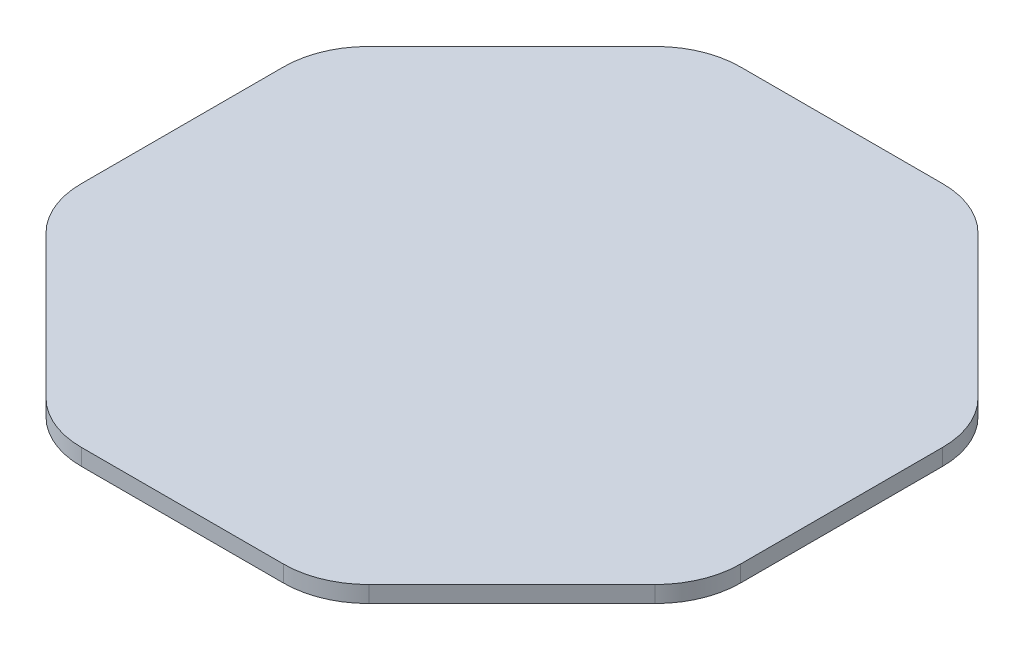
ISO-10303-21;
HEADER;
FILE_DESCRIPTION(('STEP AP214'),'2;1');
FILE_NAME('part.step','',(''),(''),'','','');
FILE_SCHEMA(('AUTOMOTIVE_DESIGN { 1 0 10303 214 1 1 1 1 }'));
ENDSEC;
DATA;
#1=APPLICATION_CONTEXT('core data for automotive mechanical design processes');
#2=APPLICATION_PROTOCOL_DEFINITION('international standard','automotive_design',2000,#1);
#3=PRODUCT_CONTEXT('',#1,'mechanical');
#4=PRODUCT('Part','Part','',(#3));
#5=PRODUCT_RELATED_PRODUCT_CATEGORY('part','',(#4));
#6=PRODUCT_DEFINITION_FORMATION('','',#4);
#7=PRODUCT_DEFINITION_CONTEXT('part definition',#1,'design');
#8=PRODUCT_DEFINITION('design','',#6,#7);
#9=PRODUCT_DEFINITION_SHAPE('','',#8);
#10=(LENGTH_UNIT() NAMED_UNIT(*) SI_UNIT(.MILLI.,.METRE.));
#11=(NAMED_UNIT(*) PLANE_ANGLE_UNIT() SI_UNIT($,.RADIAN.));
#12=(NAMED_UNIT(*) SI_UNIT($,.STERADIAN.) SOLID_ANGLE_UNIT());
#13=UNCERTAINTY_MEASURE_WITH_UNIT(LENGTH_MEASURE(1.E-05),#10,'distance_accuracy_value','');
#14=(GEOMETRIC_REPRESENTATION_CONTEXT(3) GLOBAL_UNCERTAINTY_ASSIGNED_CONTEXT((#13)) GLOBAL_UNIT_ASSIGNED_CONTEXT((#10,
#11,#12)) REPRESENTATION_CONTEXT('',''));
#15=CARTESIAN_POINT('',(0.,0.,0.));
#16=DIRECTION('',(0.,0.,1.));
#17=DIRECTION('',(1.,0.,0.));
#18=AXIS2_PLACEMENT_3D('',#15,#16,#17);
#19=CARTESIAN_POINT('',(0.,0.,0.));
#20=DIRECTION('',(0.,1.,0.));
#21=DIRECTION('',(0.,0.,1.));
#22=AXIS2_PLACEMENT_3D('',#19,#20,#21);
#23=PLANE('',#22);
#24=DIRECTION('',(0.,0.,-1.));
#25=VECTOR('',#24,1.);
#26=CARTESIAN_POINT('',(60.,0.,0.));
#27=LINE('',#26,#25);
#28=CARTESIAN_POINT('',(60.,0.,18.4325035256027));
#29=VERTEX_POINT('',#28);
#30=CARTESIAN_POINT('',(60.,0.,-18.4325035256027));
#31=VERTEX_POINT('',#30);
#32=EDGE_CURVE('E227',#29,#31,#27,.T.);
#33=ORIENTED_EDGE('',*,*,#32,.F.);
#34=CARTESIAN_POINT('',(44.5,0.,18.4325035256027));
#35=DIRECTION('',(0.,1.,0.));
#36=DIRECTION('',(0.,0.,1.));
#37=AXIS2_PLACEMENT_3D('',#34,#35,#36);
#38=CIRCLE('',#37,15.5);
#39=CARTESIAN_POINT('',(55.4601551083915,0.,29.3926586339941));
#40=VERTEX_POINT('',#39);
#41=EDGE_CURVE('E210',#29,#40,#38,.F.);
#42=ORIENTED_EDGE('',*,*,#41,.T.);
#43=DIRECTION('',(0.707106781186547,0.,-0.707106781186548));
#44=VECTOR('',#43,1.);
#45=CARTESIAN_POINT('',(42.4264068711929,0.,42.4264068711928));
#46=LINE('',#45,#44);
#47=CARTESIAN_POINT('',(29.3926586339942,0.,55.4601551083915));
#48=VERTEX_POINT('',#47);
#49=EDGE_CURVE('E236',#48,#40,#46,.T.);
#50=ORIENTED_EDGE('',*,*,#49,.F.);
#51=CARTESIAN_POINT('',(18.4325035256027,0.,44.5));
#52=DIRECTION('',(0.,1.,0.));
#53=DIRECTION('',(0.,0.,1.));
#54=AXIS2_PLACEMENT_3D('',#51,#52,#53);
#55=CIRCLE('',#54,15.5);
#56=CARTESIAN_POINT('',(18.4325035256027,0.,60.));
#57=VERTEX_POINT('',#56);
#58=EDGE_CURVE('E231',#48,#57,#55,.F.);
#59=ORIENTED_EDGE('',*,*,#58,.T.);
#60=DIRECTION('',(1.,0.,0.));
#61=VECTOR('',#60,1.);
#62=CARTESIAN_POINT('',(0.,0.,60.));
#63=LINE('',#62,#61);
#64=CARTESIAN_POINT('',(-18.4325035256026,0.,60.));
#65=VERTEX_POINT('',#64);
#66=EDGE_CURVE('E241',#65,#57,#63,.T.);
#67=ORIENTED_EDGE('',*,*,#66,.F.);
#68=CARTESIAN_POINT('',(-18.4325035256026,0.,44.5));
#69=DIRECTION('',(0.,1.,0.));
#70=DIRECTION('',(0.,0.,1.));
#71=AXIS2_PLACEMENT_3D('',#68,#69,#70);
#72=CIRCLE('',#71,15.5);
#73=CARTESIAN_POINT('',(-29.3926586339941,0.,55.4601551083915));
#74=VERTEX_POINT('',#73);
#75=EDGE_CURVE('E253',#65,#74,#72,.F.);
#76=ORIENTED_EDGE('',*,*,#75,.T.);
#77=DIRECTION('',(0.707106781186548,0.,0.707106781186547));
#78=VECTOR('',#77,1.);
#79=CARTESIAN_POINT('',(-42.4264068711928,0.,42.4264068711929));
#80=LINE('',#79,#78);
#81=CARTESIAN_POINT('',(-55.4601551083915,0.,29.3926586339942));
#82=VERTEX_POINT('',#81);
#83=EDGE_CURVE('E329',#82,#74,#80,.T.);
#84=ORIENTED_EDGE('',*,*,#83,.F.);
#85=CARTESIAN_POINT('',(-44.5,0.,18.4325035256027));
#86=DIRECTION('',(0.,1.,0.));
#87=DIRECTION('',(0.,0.,1.));
#88=AXIS2_PLACEMENT_3D('',#85,#86,#87);
#89=CIRCLE('',#88,15.5);
#90=CARTESIAN_POINT('',(-60.,0.,18.4325035256027));
#91=VERTEX_POINT('',#90);
#92=EDGE_CURVE('E255',#82,#91,#89,.F.);
#93=ORIENTED_EDGE('',*,*,#92,.T.);
#94=DIRECTION('',(0.,0.,1.));
#95=VECTOR('',#94,1.);
#96=CARTESIAN_POINT('',(-60.,0.,0.));
#97=LINE('',#96,#95);
#98=CARTESIAN_POINT('',(-60.,0.,-18.4325035256026));
#99=VERTEX_POINT('',#98);
#100=EDGE_CURVE('E330',#99,#91,#97,.T.);
#101=ORIENTED_EDGE('',*,*,#100,.F.);
#102=CARTESIAN_POINT('',(-44.5,0.,-18.4325035256026));
#103=DIRECTION('',(0.,1.,0.));
#104=DIRECTION('',(0.,0.,1.));
#105=AXIS2_PLACEMENT_3D('',#102,#103,#104);
#106=CIRCLE('',#105,15.5);
#107=CARTESIAN_POINT('',(-55.4601551083915,0.,-29.3926586339941));
#108=VERTEX_POINT('',#107);
#109=EDGE_CURVE('E257',#99,#108,#106,.F.);
#110=ORIENTED_EDGE('',*,*,#109,.T.);
#111=DIRECTION('',(-0.707106781186547,0.,0.707106781186548));
#112=VECTOR('',#111,1.);
#113=CARTESIAN_POINT('',(-42.4264068711929,0.,-42.4264068711928));
#114=LINE('',#113,#112);
#115=CARTESIAN_POINT('',(-29.3926586339942,0.,-55.4601551083915));
#116=VERTEX_POINT('',#115);
#117=EDGE_CURVE('E247',#116,#108,#114,.T.);
#118=ORIENTED_EDGE('',*,*,#117,.F.);
#119=CARTESIAN_POINT('',(-18.4325035256027,0.,-44.5));
#120=DIRECTION('',(0.,1.,0.));
#121=DIRECTION('',(0.,0.,1.));
#122=AXIS2_PLACEMENT_3D('',#119,#120,#121);
#123=CIRCLE('',#122,15.5);
#124=CARTESIAN_POINT('',(-18.4325035256027,0.,-60.));
#125=VERTEX_POINT('',#124);
#126=EDGE_CURVE('E259',#116,#125,#123,.F.);
#127=ORIENTED_EDGE('',*,*,#126,.T.);
#128=DIRECTION('',(-1.,0.,0.));
#129=VECTOR('',#128,1.);
#130=CARTESIAN_POINT('',(0.,0.,-60.));
#131=LINE('',#130,#129);
#132=CARTESIAN_POINT('',(18.4325035256027,0.,-60.));
#133=VERTEX_POINT('',#132);
#134=EDGE_CURVE('E239',#133,#125,#131,.T.);
#135=ORIENTED_EDGE('',*,*,#134,.F.);
#136=CARTESIAN_POINT('',(18.4325035256027,0.,-44.5));
#137=DIRECTION('',(0.,1.,0.));
#138=DIRECTION('',(0.,0.,1.));
#139=AXIS2_PLACEMENT_3D('',#136,#137,#138);
#140=CIRCLE('',#139,15.5);
#141=CARTESIAN_POINT('',(29.3926586339942,0.,-55.4601551083915));
#142=VERTEX_POINT('',#141);
#143=EDGE_CURVE('E261',#133,#142,#140,.F.);
#144=ORIENTED_EDGE('',*,*,#143,.T.);
#145=DIRECTION('',(-0.707106781186548,0.,-0.707106781186547));
#146=VECTOR('',#145,1.);
#147=CARTESIAN_POINT('',(42.4264068711928,0.,-42.4264068711929));
#148=LINE('',#147,#146);
#149=CARTESIAN_POINT('',(55.4601551083915,0.,-29.3926586339942));
#150=VERTEX_POINT('',#149);
#151=EDGE_CURVE('E235',#150,#142,#148,.T.);
#152=ORIENTED_EDGE('',*,*,#151,.F.);
#153=CARTESIAN_POINT('',(44.5,0.,-18.4325035256027));
#154=DIRECTION('',(0.,1.,0.));
#155=DIRECTION('',(0.,0.,1.));
#156=AXIS2_PLACEMENT_3D('',#153,#154,#155);
#157=CIRCLE('',#156,15.5);
#158=EDGE_CURVE('E221',#150,#31,#157,.F.);
#159=ORIENTED_EDGE('',*,*,#158,.T.);
#160=EDGE_LOOP('',(#33,#42,#50,#59,#67,#76,#84,#93,#101,#110,#118,#127,#135,#144,#152,#159));
#161=FACE_BOUND('',#160,.T.);
#162=ADVANCED_FACE('F95',(#161),#23,.F.);
#163=CARTESIAN_POINT('',(60.,3.,0.));
#164=DIRECTION('',(-1.,0.,0.));
#165=DIRECTION('',(0.,0.,1.));
#166=AXIS2_PLACEMENT_3D('',#163,#164,#165);
#167=PLANE('',#166);
#168=DIRECTION('',(0.,0.,-1.));
#169=VECTOR('',#168,1.);
#170=CARTESIAN_POINT('',(60.,3.,0.));
#171=LINE('',#170,#169);
#172=CARTESIAN_POINT('',(60.,3.,18.4325035256027));
#173=VERTEX_POINT('',#172);
#174=CARTESIAN_POINT('',(60.,3.,-18.4325035256027));
#175=VERTEX_POINT('',#174);
#176=EDGE_CURVE('E230',#173,#175,#171,.T.);
#177=ORIENTED_EDGE('',*,*,#176,.F.);
#178=DIRECTION('',(0.,-1.,0.));
#179=VECTOR('',#178,1.);
#180=CARTESIAN_POINT('',(60.,3.,18.4325035256027));
#181=LINE('',#180,#179);
#182=EDGE_CURVE('E214',#173,#29,#181,.T.);
#183=ORIENTED_EDGE('',*,*,#182,.T.);
#184=ORIENTED_EDGE('',*,*,#32,.T.);
#185=DIRECTION('',(0.,-1.,0.));
#186=VECTOR('',#185,1.);
#187=CARTESIAN_POINT('',(60.,3.,-18.4325035256027));
#188=LINE('',#187,#186);
#189=EDGE_CURVE('E232',#31,#175,#188,.F.);
#190=ORIENTED_EDGE('',*,*,#189,.T.);
#191=EDGE_LOOP('',(#177,#183,#184,#190));
#192=FACE_BOUND('',#191,.T.);
#193=ADVANCED_FACE('F226',(#192),#167,.F.);
#194=CARTESIAN_POINT('',(42.4264068711929,3.,42.4264068711928));
#195=DIRECTION('',(-0.707106781186548,0.,-0.707106781186547));
#196=DIRECTION('',(-0.707106781186547,0.,0.707106781186548));
#197=AXIS2_PLACEMENT_3D('',#194,#195,#196);
#198=PLANE('',#197);
#199=ORIENTED_EDGE('',*,*,#49,.T.);
#200=DIRECTION('',(0.,-1.,0.));
#201=VECTOR('',#200,1.);
#202=CARTESIAN_POINT('',(55.4601551083915,3.,29.3926586339941));
#203=LINE('',#202,#201);
#204=CARTESIAN_POINT('',(55.4601551083915,3.,29.3926586339941));
#205=VERTEX_POINT('',#204);
#206=EDGE_CURVE('E215',#40,#205,#203,.F.);
#207=ORIENTED_EDGE('',*,*,#206,.T.);
#208=DIRECTION('',(0.707106781186547,0.,-0.707106781186548));
#209=VECTOR('',#208,1.);
#210=CARTESIAN_POINT('',(42.4264068711929,3.,42.4264068711928));
#211=LINE('',#210,#209);
#212=CARTESIAN_POINT('',(29.3926586339942,3.,55.4601551083915));
#213=VERTEX_POINT('',#212);
#214=EDGE_CURVE('E321',#213,#205,#211,.T.);
#215=ORIENTED_EDGE('',*,*,#214,.F.);
#216=DIRECTION('',(0.,-1.,0.));
#217=VECTOR('',#216,1.);
#218=CARTESIAN_POINT('',(29.3926586339942,3.,55.4601551083915));
#219=LINE('',#218,#217);
#220=EDGE_CURVE('E220',#213,#48,#219,.T.);
#221=ORIENTED_EDGE('',*,*,#220,.T.);
#222=EDGE_LOOP('',(#199,#207,#215,#221));
#223=FACE_BOUND('',#222,.T.);
#224=ADVANCED_FACE('F326',(#223),#198,.F.);
#225=CARTESIAN_POINT('',(0.,3.,60.));
#226=DIRECTION('',(0.,0.,-1.));
#227=DIRECTION('',(-1.,0.,0.));
#228=AXIS2_PLACEMENT_3D('',#225,#226,#227);
#229=PLANE('',#228);
#230=DIRECTION('',(1.,0.,0.));
#231=VECTOR('',#230,1.);
#232=CARTESIAN_POINT('',(0.,3.,60.));
#233=LINE('',#232,#231);
#234=CARTESIAN_POINT('',(-18.4325035256026,3.,60.));
#235=VERTEX_POINT('',#234);
#236=CARTESIAN_POINT('',(18.4325035256027,3.,60.));
#237=VERTEX_POINT('',#236);
#238=EDGE_CURVE('E311',#235,#237,#233,.T.);
#239=ORIENTED_EDGE('',*,*,#238,.F.);
#240=DIRECTION('',(0.,-1.,0.));
#241=VECTOR('',#240,1.);
#242=CARTESIAN_POINT('',(-18.4325035256026,3.,60.));
#243=LINE('',#242,#241);
#244=EDGE_CURVE('E12',#235,#65,#243,.T.);
#245=ORIENTED_EDGE('',*,*,#244,.T.);
#246=ORIENTED_EDGE('',*,*,#66,.T.);
#247=DIRECTION('',(0.,-1.,0.));
#248=VECTOR('',#247,1.);
#249=CARTESIAN_POINT('',(18.4325035256027,3.,60.));
#250=LINE('',#249,#248);
#251=EDGE_CURVE('E103',#57,#237,#250,.F.);
#252=ORIENTED_EDGE('',*,*,#251,.T.);
#253=EDGE_LOOP('',(#239,#245,#246,#252));
#254=FACE_BOUND('',#253,.T.);
#255=ADVANCED_FACE('F310',(#254),#229,.F.);
#256=CARTESIAN_POINT('',(-42.4264068711928,3.,42.4264068711929));
#257=DIRECTION('',(0.707106781186547,0.,-0.707106781186548));
#258=DIRECTION('',(-0.707106781186548,0.,-0.707106781186547));
#259=AXIS2_PLACEMENT_3D('',#256,#257,#258);
#260=PLANE('',#259);
#261=DIRECTION('',(0.707106781186548,0.,0.707106781186547));
#262=VECTOR('',#261,1.);
#263=CARTESIAN_POINT('',(-42.4264068711928,3.,42.4264068711929));
#264=LINE('',#263,#262);
#265=CARTESIAN_POINT('',(-55.4601551083915,3.,29.3926586339942));
#266=VERTEX_POINT('',#265);
#267=CARTESIAN_POINT('',(-29.3926586339941,3.,55.4601551083915));
#268=VERTEX_POINT('',#267);
#269=EDGE_CURVE('E322',#266,#268,#264,.T.);
#270=ORIENTED_EDGE('',*,*,#269,.F.);
#271=DIRECTION('',(0.,-1.,0.));
#272=VECTOR('',#271,1.);
#273=CARTESIAN_POINT('',(-55.4601551083915,3.,29.3926586339942));
#274=LINE('',#273,#272);
#275=EDGE_CURVE('E303',#266,#82,#274,.T.);
#276=ORIENTED_EDGE('',*,*,#275,.T.);
#277=ORIENTED_EDGE('',*,*,#83,.T.);
#278=DIRECTION('',(0.,-1.,0.));
#279=VECTOR('',#278,1.);
#280=CARTESIAN_POINT('',(-29.3926586339941,3.,55.4601551083915));
#281=LINE('',#280,#279);
#282=EDGE_CURVE('E301',#74,#268,#281,.F.);
#283=ORIENTED_EDGE('',*,*,#282,.T.);
#284=EDGE_LOOP('',(#270,#276,#277,#283));
#285=FACE_BOUND('',#284,.T.);
#286=ADVANCED_FACE('F356',(#285),#260,.F.);
#287=CARTESIAN_POINT('',(-60.,3.,0.));
#288=DIRECTION('',(1.,0.,0.));
#289=DIRECTION('',(0.,0.,-1.));
#290=AXIS2_PLACEMENT_3D('',#287,#288,#289);
#291=PLANE('',#290);
#292=DIRECTION('',(0.,0.,1.));
#293=VECTOR('',#292,1.);
#294=CARTESIAN_POINT('',(-60.,3.,0.));
#295=LINE('',#294,#293);
#296=CARTESIAN_POINT('',(-60.,3.,-18.4325035256026));
#297=VERTEX_POINT('',#296);
#298=CARTESIAN_POINT('',(-60.,3.,18.4325035256027));
#299=VERTEX_POINT('',#298);
#300=EDGE_CURVE('E249',#297,#299,#295,.T.);
#301=ORIENTED_EDGE('',*,*,#300,.F.);
#302=DIRECTION('',(0.,-1.,0.));
#303=VECTOR('',#302,1.);
#304=CARTESIAN_POINT('',(-60.,3.,-18.4325035256026));
#305=LINE('',#304,#303);
#306=EDGE_CURVE('E298',#297,#99,#305,.T.);
#307=ORIENTED_EDGE('',*,*,#306,.T.);
#308=ORIENTED_EDGE('',*,*,#100,.T.);
#309=DIRECTION('',(0.,-1.,0.));
#310=VECTOR('',#309,1.);
#311=CARTESIAN_POINT('',(-60.,3.,18.4325035256027));
#312=LINE('',#311,#310);
#313=EDGE_CURVE('E296',#91,#299,#312,.F.);
#314=ORIENTED_EDGE('',*,*,#313,.T.);
#315=EDGE_LOOP('',(#301,#307,#308,#314));
#316=FACE_BOUND('',#315,.T.);
#317=ADVANCED_FACE('F359',(#316),#291,.F.);
#318=CARTESIAN_POINT('',(-42.4264068711929,3.,-42.4264068711928));
#319=DIRECTION('',(0.707106781186548,0.,0.707106781186547));
#320=DIRECTION('',(0.707106781186547,0.,-0.707106781186548));
#321=AXIS2_PLACEMENT_3D('',#318,#319,#320);
#322=PLANE('',#321);
#323=DIRECTION('',(-0.707106781186547,0.,0.707106781186548));
#324=VECTOR('',#323,1.);
#325=CARTESIAN_POINT('',(-42.4264068711929,3.,-42.4264068711928));
#326=LINE('',#325,#324);
#327=CARTESIAN_POINT('',(-29.3926586339942,3.,-55.4601551083915));
#328=VERTEX_POINT('',#327);
#329=CARTESIAN_POINT('',(-55.4601551083915,3.,-29.3926586339941));
#330=VERTEX_POINT('',#329);
#331=EDGE_CURVE('E250',#328,#330,#326,.T.);
#332=ORIENTED_EDGE('',*,*,#331,.F.);
#333=DIRECTION('',(0.,-1.,0.));
#334=VECTOR('',#333,1.);
#335=CARTESIAN_POINT('',(-29.3926586339942,3.,-55.4601551083915));
#336=LINE('',#335,#334);
#337=EDGE_CURVE('E293',#328,#116,#336,.T.);
#338=ORIENTED_EDGE('',*,*,#337,.T.);
#339=ORIENTED_EDGE('',*,*,#117,.T.);
#340=DIRECTION('',(0.,-1.,0.));
#341=VECTOR('',#340,1.);
#342=CARTESIAN_POINT('',(-55.4601551083915,3.,-29.3926586339941));
#343=LINE('',#342,#341);
#344=EDGE_CURVE('E110',#108,#330,#343,.F.);
#345=ORIENTED_EDGE('',*,*,#344,.T.);
#346=EDGE_LOOP('',(#332,#338,#339,#345));
#347=FACE_BOUND('',#346,.T.);
#348=ADVANCED_FACE('F363',(#347),#322,.F.);
#349=CARTESIAN_POINT('',(0.,3.,-60.));
#350=DIRECTION('',(0.,0.,1.));
#351=DIRECTION('',(1.,0.,0.));
#352=AXIS2_PLACEMENT_3D('',#349,#350,#351);
#353=PLANE('',#352);
#354=DIRECTION('',(-1.,0.,0.));
#355=VECTOR('',#354,1.);
#356=CARTESIAN_POINT('',(0.,3.,-60.));
#357=LINE('',#356,#355);
#358=CARTESIAN_POINT('',(18.4325035256027,3.,-60.));
#359=VERTEX_POINT('',#358);
#360=CARTESIAN_POINT('',(-18.4325035256027,3.,-60.));
#361=VERTEX_POINT('',#360);
#362=EDGE_CURVE('E336',#359,#361,#357,.T.);
#363=ORIENTED_EDGE('',*,*,#362,.F.);
#364=DIRECTION('',(0.,-1.,0.));
#365=VECTOR('',#364,1.);
#366=CARTESIAN_POINT('',(18.4325035256027,3.,-60.));
#367=LINE('',#366,#365);
#368=EDGE_CURVE('E289',#359,#133,#367,.T.);
#369=ORIENTED_EDGE('',*,*,#368,.T.);
#370=ORIENTED_EDGE('',*,*,#134,.T.);
#371=DIRECTION('',(0.,-1.,0.));
#372=VECTOR('',#371,1.);
#373=CARTESIAN_POINT('',(-18.4325035256027,3.,-60.));
#374=LINE('',#373,#372);
#375=EDGE_CURVE('E287',#125,#361,#374,.F.);
#376=ORIENTED_EDGE('',*,*,#375,.T.);
#377=EDGE_LOOP('',(#363,#369,#370,#376));
#378=FACE_BOUND('',#377,.T.);
#379=ADVANCED_FACE('F371',(#378),#353,.F.);
#380=CARTESIAN_POINT('',(42.4264068711928,3.,-42.4264068711929));
#381=DIRECTION('',(-0.707106781186547,0.,0.707106781186548));
#382=DIRECTION('',(0.707106781186548,0.,0.707106781186547));
#383=AXIS2_PLACEMENT_3D('',#380,#381,#382);
#384=PLANE('',#383);
#385=DIRECTION('',(-0.707106781186548,0.,-0.707106781186547));
#386=VECTOR('',#385,1.);
#387=CARTESIAN_POINT('',(42.4264068711928,3.,-42.4264068711929));
#388=LINE('',#387,#386);
#389=CARTESIAN_POINT('',(55.4601551083915,3.,-29.3926586339942));
#390=VERTEX_POINT('',#389);
#391=CARTESIAN_POINT('',(29.3926586339942,3.,-55.4601551083915));
#392=VERTEX_POINT('',#391);
#393=EDGE_CURVE('E338',#390,#392,#388,.T.);
#394=ORIENTED_EDGE('',*,*,#393,.F.);
#395=DIRECTION('',(0.,-1.,0.));
#396=VECTOR('',#395,1.);
#397=CARTESIAN_POINT('',(55.4601551083915,3.,-29.3926586339942));
#398=LINE('',#397,#396);
#399=EDGE_CURVE('E284',#390,#150,#398,.T.);
#400=ORIENTED_EDGE('',*,*,#399,.T.);
#401=ORIENTED_EDGE('',*,*,#151,.T.);
#402=DIRECTION('',(0.,-1.,0.));
#403=VECTOR('',#402,1.);
#404=CARTESIAN_POINT('',(29.3926586339942,3.,-55.4601551083915));
#405=LINE('',#404,#403);
#406=EDGE_CURVE('E282',#142,#392,#405,.F.);
#407=ORIENTED_EDGE('',*,*,#406,.T.);
#408=EDGE_LOOP('',(#394,#400,#401,#407));
#409=FACE_BOUND('',#408,.T.);
#410=ADVANCED_FACE('F379',(#409),#384,.F.);
#411=CARTESIAN_POINT('',(0.,3.,0.));
#412=DIRECTION('',(0.,1.,0.));
#413=DIRECTION('',(0.,0.,1.));
#414=AXIS2_PLACEMENT_3D('',#411,#412,#413);
#415=PLANE('',#414);
#416=ORIENTED_EDGE('',*,*,#214,.T.);
#417=CARTESIAN_POINT('',(44.5,3.,18.4325035256027));
#418=DIRECTION('',(0.,1.,0.));
#419=DIRECTION('',(0.,0.,1.));
#420=AXIS2_PLACEMENT_3D('',#417,#418,#419);
#421=CIRCLE('',#420,15.5);
#422=EDGE_CURVE('E280',#205,#173,#421,.T.);
#423=ORIENTED_EDGE('',*,*,#422,.T.);
#424=ORIENTED_EDGE('',*,*,#176,.T.);
#425=CARTESIAN_POINT('',(44.5,3.,-18.4325035256027));
#426=DIRECTION('',(0.,1.,0.));
#427=DIRECTION('',(0.,0.,1.));
#428=AXIS2_PLACEMENT_3D('',#425,#426,#427);
#429=CIRCLE('',#428,15.5);
#430=EDGE_CURVE('E278',#175,#390,#429,.T.);
#431=ORIENTED_EDGE('',*,*,#430,.T.);
#432=ORIENTED_EDGE('',*,*,#393,.T.);
#433=CARTESIAN_POINT('',(18.4325035256027,3.,-44.5));
#434=DIRECTION('',(0.,1.,0.));
#435=DIRECTION('',(0.,0.,1.));
#436=AXIS2_PLACEMENT_3D('',#433,#434,#435);
#437=CIRCLE('',#436,15.5);
#438=EDGE_CURVE('E276',#392,#359,#437,.T.);
#439=ORIENTED_EDGE('',*,*,#438,.T.);
#440=ORIENTED_EDGE('',*,*,#362,.T.);
#441=CARTESIAN_POINT('',(-18.4325035256027,3.,-44.5));
#442=DIRECTION('',(0.,1.,0.));
#443=DIRECTION('',(0.,0.,1.));
#444=AXIS2_PLACEMENT_3D('',#441,#442,#443);
#445=CIRCLE('',#444,15.5);
#446=EDGE_CURVE('E117',#361,#328,#445,.T.);
#447=ORIENTED_EDGE('',*,*,#446,.T.);
#448=ORIENTED_EDGE('',*,*,#331,.T.);
#449=CARTESIAN_POINT('',(-44.5,3.,-18.4325035256026));
#450=DIRECTION('',(0.,1.,0.));
#451=DIRECTION('',(0.,0.,1.));
#452=AXIS2_PLACEMENT_3D('',#449,#450,#451);
#453=CIRCLE('',#452,15.5);
#454=EDGE_CURVE('E273',#330,#297,#453,.T.);
#455=ORIENTED_EDGE('',*,*,#454,.T.);
#456=ORIENTED_EDGE('',*,*,#300,.T.);
#457=CARTESIAN_POINT('',(-44.5,3.,18.4325035256027));
#458=DIRECTION('',(0.,1.,0.));
#459=DIRECTION('',(0.,0.,1.));
#460=AXIS2_PLACEMENT_3D('',#457,#458,#459);
#461=CIRCLE('',#460,15.5);
#462=EDGE_CURVE('E271',#299,#266,#461,.T.);
#463=ORIENTED_EDGE('',*,*,#462,.T.);
#464=ORIENTED_EDGE('',*,*,#269,.T.);
#465=CARTESIAN_POINT('',(-18.4325035256026,3.,44.5));
#466=DIRECTION('',(0.,1.,0.));
#467=DIRECTION('',(0.,0.,1.));
#468=AXIS2_PLACEMENT_3D('',#465,#466,#467);
#469=CIRCLE('',#468,15.5);
#470=EDGE_CURVE('E269',#268,#235,#469,.T.);
#471=ORIENTED_EDGE('',*,*,#470,.T.);
#472=ORIENTED_EDGE('',*,*,#238,.T.);
#473=CARTESIAN_POINT('',(18.4325035256027,3.,44.5));
#474=DIRECTION('',(0.,1.,0.));
#475=DIRECTION('',(0.,0.,1.));
#476=AXIS2_PLACEMENT_3D('',#473,#474,#475);
#477=CIRCLE('',#476,15.5);
#478=EDGE_CURVE('E267',#237,#213,#477,.T.);
#479=ORIENTED_EDGE('',*,*,#478,.T.);
#480=EDGE_LOOP('',(#416,#423,#424,#431,#432,#439,#440,#447,#448,#455,#456,#463,#464,#471,#472,#479));
#481=FACE_BOUND('',#480,.T.);
#482=ADVANCED_FACE('F317',(#481),#415,.T.);
#483=CARTESIAN_POINT('',(44.5,3.,18.4325035256027));
#484=DIRECTION('',(0.,-1.,0.));
#485=DIRECTION('',(0.,0.,-1.));
#486=AXIS2_PLACEMENT_3D('',#483,#484,#485);
#487=CYLINDRICAL_SURFACE('',#486,15.5);
#488=ORIENTED_EDGE('',*,*,#422,.F.);
#489=ORIENTED_EDGE('',*,*,#206,.F.);
#490=ORIENTED_EDGE('',*,*,#41,.F.);
#491=ORIENTED_EDGE('',*,*,#182,.F.);
#492=EDGE_LOOP('',(#488,#489,#490,#491));
#493=FACE_BOUND('',#492,.T.);
#494=ADVANCED_FACE('F213',(#493),#487,.T.);
#495=CARTESIAN_POINT('',(44.5,3.,-18.4325035256027));
#496=DIRECTION('',(0.,-1.,0.));
#497=DIRECTION('',(0.,0.,-1.));
#498=AXIS2_PLACEMENT_3D('',#495,#496,#497);
#499=CYLINDRICAL_SURFACE('',#498,15.5);
#500=ORIENTED_EDGE('',*,*,#430,.F.);
#501=ORIENTED_EDGE('',*,*,#189,.F.);
#502=ORIENTED_EDGE('',*,*,#158,.F.);
#503=ORIENTED_EDGE('',*,*,#399,.F.);
#504=EDGE_LOOP('',(#500,#501,#502,#503));
#505=FACE_BOUND('',#504,.T.);
#506=ADVANCED_FACE('F383',(#505),#499,.T.);
#507=CARTESIAN_POINT('',(18.4325035256027,3.,-44.5));
#508=DIRECTION('',(0.,-1.,0.));
#509=DIRECTION('',(0.,0.,-1.));
#510=AXIS2_PLACEMENT_3D('',#507,#508,#509);
#511=CYLINDRICAL_SURFACE('',#510,15.5);
#512=ORIENTED_EDGE('',*,*,#438,.F.);
#513=ORIENTED_EDGE('',*,*,#406,.F.);
#514=ORIENTED_EDGE('',*,*,#143,.F.);
#515=ORIENTED_EDGE('',*,*,#368,.F.);
#516=EDGE_LOOP('',(#512,#513,#514,#515));
#517=FACE_BOUND('',#516,.T.);
#518=ADVANCED_FACE('F375',(#517),#511,.T.);
#519=CARTESIAN_POINT('',(-18.4325035256027,3.,-44.5));
#520=DIRECTION('',(0.,-1.,0.));
#521=DIRECTION('',(0.,0.,-1.));
#522=AXIS2_PLACEMENT_3D('',#519,#520,#521);
#523=CYLINDRICAL_SURFACE('',#522,15.5);
#524=ORIENTED_EDGE('',*,*,#446,.F.);
#525=ORIENTED_EDGE('',*,*,#375,.F.);
#526=ORIENTED_EDGE('',*,*,#126,.F.);
#527=ORIENTED_EDGE('',*,*,#337,.F.);
#528=EDGE_LOOP('',(#524,#525,#526,#527));
#529=FACE_BOUND('',#528,.T.);
#530=ADVANCED_FACE('F366',(#529),#523,.T.);
#531=CARTESIAN_POINT('',(-44.5,3.,-18.4325035256026));
#532=DIRECTION('',(0.,-1.,0.));
#533=DIRECTION('',(0.,0.,-1.));
#534=AXIS2_PLACEMENT_3D('',#531,#532,#533);
#535=CYLINDRICAL_SURFACE('',#534,15.5);
#536=ORIENTED_EDGE('',*,*,#454,.F.);
#537=ORIENTED_EDGE('',*,*,#344,.F.);
#538=ORIENTED_EDGE('',*,*,#109,.F.);
#539=ORIENTED_EDGE('',*,*,#306,.F.);
#540=EDGE_LOOP('',(#536,#537,#538,#539));
#541=FACE_BOUND('',#540,.T.);
#542=ADVANCED_FACE('F361',(#541),#535,.T.);
#543=CARTESIAN_POINT('',(-44.5,3.,18.4325035256027));
#544=DIRECTION('',(0.,-1.,0.));
#545=DIRECTION('',(0.,0.,-1.));
#546=AXIS2_PLACEMENT_3D('',#543,#544,#545);
#547=CYLINDRICAL_SURFACE('',#546,15.5);
#548=ORIENTED_EDGE('',*,*,#462,.F.);
#549=ORIENTED_EDGE('',*,*,#313,.F.);
#550=ORIENTED_EDGE('',*,*,#92,.F.);
#551=ORIENTED_EDGE('',*,*,#275,.F.);
#552=EDGE_LOOP('',(#548,#549,#550,#551));
#553=FACE_BOUND('',#552,.T.);
#554=ADVANCED_FACE('F354',(#553),#547,.T.);
#555=CARTESIAN_POINT('',(-18.4325035256026,3.,44.5));
#556=DIRECTION('',(0.,-1.,0.));
#557=DIRECTION('',(0.,0.,-1.));
#558=AXIS2_PLACEMENT_3D('',#555,#556,#557);
#559=CYLINDRICAL_SURFACE('',#558,15.5);
#560=ORIENTED_EDGE('',*,*,#470,.F.);
#561=ORIENTED_EDGE('',*,*,#282,.F.);
#562=ORIENTED_EDGE('',*,*,#75,.F.);
#563=ORIENTED_EDGE('',*,*,#244,.F.);
#564=EDGE_LOOP('',(#560,#561,#562,#563));
#565=FACE_BOUND('',#564,.T.);
#566=ADVANCED_FACE('F478',(#565),#559,.T.);
#567=CARTESIAN_POINT('',(18.4325035256027,3.,44.5));
#568=DIRECTION('',(0.,-1.,0.));
#569=DIRECTION('',(0.,0.,-1.));
#570=AXIS2_PLACEMENT_3D('',#567,#568,#569);
#571=CYLINDRICAL_SURFACE('',#570,15.5);
#572=ORIENTED_EDGE('',*,*,#478,.F.);
#573=ORIENTED_EDGE('',*,*,#251,.F.);
#574=ORIENTED_EDGE('',*,*,#58,.F.);
#575=ORIENTED_EDGE('',*,*,#220,.F.);
#576=EDGE_LOOP('',(#572,#573,#574,#575));
#577=FACE_BOUND('',#576,.T.);
#578=ADVANCED_FACE('F97',(#577),#571,.T.);
#579=CLOSED_SHELL('',(#162,#193,#224,#255,#286,#317,#348,#379,#410,#482,#494,#506,#518,#530,
#542,#554,#566,#578));
#580=MANIFOLD_SOLID_BREP('B2',#579);
#581=ADVANCED_BREP_SHAPE_REPRESENTATION('',(#18,#580),#14);
#582=SHAPE_DEFINITION_REPRESENTATION(#9,#581);
ENDSEC;
END-ISO-10303-21;
